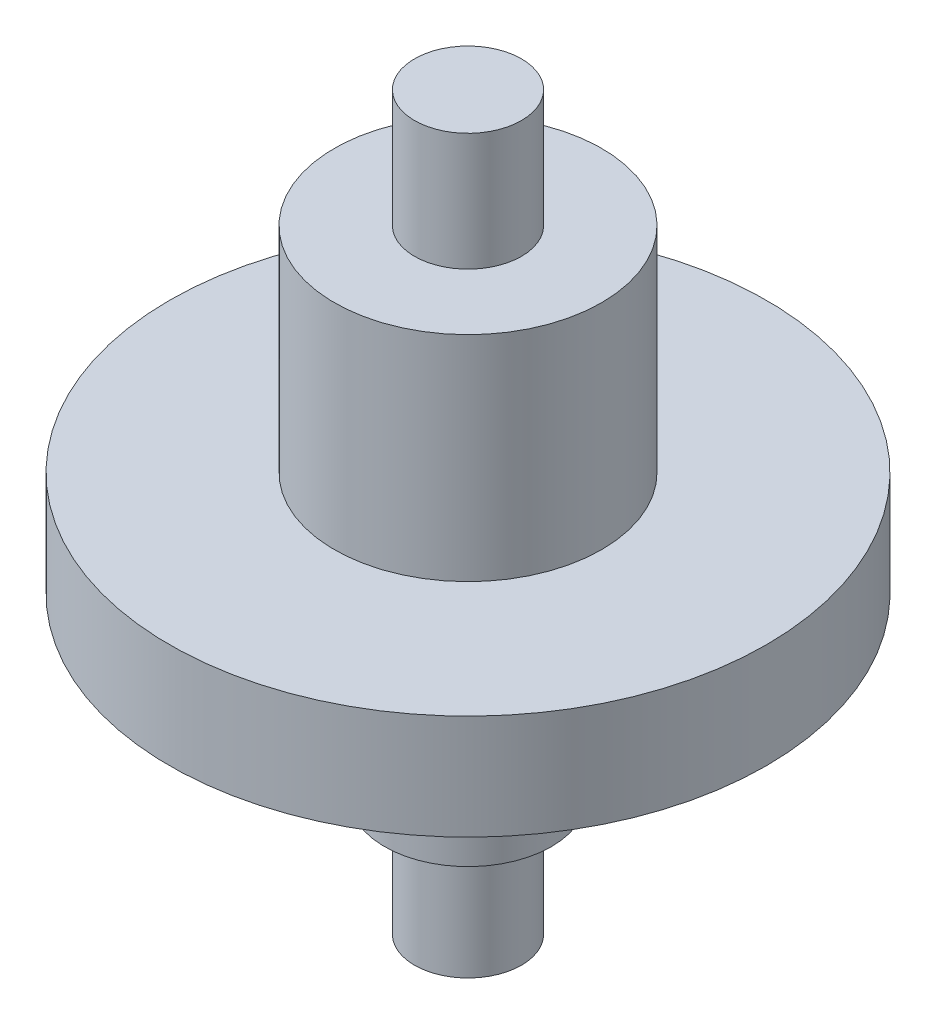
ISO-10303-21;
HEADER;
FILE_DESCRIPTION(('STEP AP214'),'2;1');
FILE_NAME('part.step','',(''),(''),'','','');
FILE_SCHEMA(('AUTOMOTIVE_DESIGN { 1 0 10303 214 1 1 1 1 }'));
ENDSEC;
DATA;
#1=APPLICATION_CONTEXT('core data for automotive mechanical design processes');
#2=APPLICATION_PROTOCOL_DEFINITION('international standard','automotive_design',2000,#1);
#3=PRODUCT_CONTEXT('',#1,'mechanical');
#4=PRODUCT('Part','Part','',(#3));
#5=PRODUCT_RELATED_PRODUCT_CATEGORY('part','',(#4));
#6=PRODUCT_DEFINITION_FORMATION('','',#4);
#7=PRODUCT_DEFINITION_CONTEXT('part definition',#1,'design');
#8=PRODUCT_DEFINITION('design','',#6,#7);
#9=PRODUCT_DEFINITION_SHAPE('','',#8);
#10=(LENGTH_UNIT() NAMED_UNIT(*) SI_UNIT(.MILLI.,.METRE.));
#11=(NAMED_UNIT(*) PLANE_ANGLE_UNIT() SI_UNIT($,.RADIAN.));
#12=(NAMED_UNIT(*) SI_UNIT($,.STERADIAN.) SOLID_ANGLE_UNIT());
#13=UNCERTAINTY_MEASURE_WITH_UNIT(LENGTH_MEASURE(1.E-05),#10,'distance_accuracy_value','');
#14=(GEOMETRIC_REPRESENTATION_CONTEXT(3) GLOBAL_UNCERTAINTY_ASSIGNED_CONTEXT((#13)) GLOBAL_UNIT_ASSIGNED_CONTEXT((#10,
#11,#12)) REPRESENTATION_CONTEXT('',''));
#15=CARTESIAN_POINT('',(0.,0.,0.));
#16=DIRECTION('',(0.,0.,1.));
#17=DIRECTION('',(1.,0.,0.));
#18=AXIS2_PLACEMENT_3D('',#15,#16,#17);
#19=CARTESIAN_POINT('',(1.25000000000002,0.,0.));
#20=DIRECTION('',(0.,-1.,0.));
#21=DIRECTION('',(1.,0.,0.));
#22=AXIS2_PLACEMENT_3D('',#19,#20,#21);
#23=PLANE('',#22);
#24=CARTESIAN_POINT('',(0.,0.,0.));
#25=DIRECTION('',(0.,-1.,0.));
#26=DIRECTION('',(1.,0.,0.));
#27=AXIS2_PLACEMENT_3D('',#24,#25,#26);
#28=CIRCLE('',#27,1.25000000000002);
#29=CARTESIAN_POINT('',(1.25000000000002,0.,0.));
#30=VERTEX_POINT('',#29);
#31=EDGE_CURVE('E66',#30,#30,#28,.T.);
#32=ORIENTED_EDGE('',*,*,#31,.T.);
#33=EDGE_LOOP('',(#32));
#34=FACE_BOUND('',#33,.T.);
#35=ADVANCED_FACE('F32',(#34),#23,.T.);
#36=CARTESIAN_POINT('',(0.,17.1,0.));
#37=DIRECTION('',(0.,1.,0.));
#38=DIRECTION('',(-1.,0.,0.));
#39=AXIS2_PLACEMENT_3D('',#36,#37,#38);
#40=PLANE('',#39);
#41=CARTESIAN_POINT('',(0.,17.1,0.));
#42=DIRECTION('',(0.,-1.,0.));
#43=DIRECTION('',(1.,0.,0.));
#44=AXIS2_PLACEMENT_3D('',#41,#42,#43);
#45=CIRCLE('',#44,1.25);
#46=CARTESIAN_POINT('',(1.25,17.1,0.));
#47=VERTEX_POINT('',#46);
#48=EDGE_CURVE('E10',#47,#47,#45,.T.);
#49=ORIENTED_EDGE('',*,*,#48,.F.);
#50=EDGE_LOOP('',(#49));
#51=FACE_BOUND('',#50,.T.);
#52=ADVANCED_FACE('F83',(#51),#40,.T.);
#53=CARTESIAN_POINT('',(0.,0.,0.));
#54=DIRECTION('',(0.,-1.,0.));
#55=DIRECTION('',(1.,0.,0.));
#56=AXIS2_PLACEMENT_3D('',#53,#54,#55);
#57=CYLINDRICAL_SURFACE('',#56,1.25);
#58=ORIENTED_EDGE('',*,*,#48,.T.);
#59=EDGE_LOOP('',(#58));
#60=FACE_BOUND('',#59,.T.);
#61=CARTESIAN_POINT('',(0.,14.35,0.));
#62=DIRECTION('',(0.,-1.,0.));
#63=DIRECTION('',(1.,0.,0.));
#64=AXIS2_PLACEMENT_3D('',#61,#62,#63);
#65=CIRCLE('',#64,1.25);
#66=CARTESIAN_POINT('',(1.25,14.35,0.));
#67=VERTEX_POINT('',#66);
#68=EDGE_CURVE('E38',#67,#67,#65,.T.);
#69=ORIENTED_EDGE('',*,*,#68,.F.);
#70=EDGE_LOOP('',(#69));
#71=FACE_BOUND('',#70,.T.);
#72=ADVANCED_FACE('F87',(#60,#71),#57,.T.);
#73=CARTESIAN_POINT('',(1.25,14.35,0.));
#74=DIRECTION('',(0.,1.,0.));
#75=DIRECTION('',(-1.,0.,0.));
#76=AXIS2_PLACEMENT_3D('',#73,#74,#75);
#77=PLANE('',#76);
#78=ORIENTED_EDGE('',*,*,#68,.T.);
#79=EDGE_LOOP('',(#78));
#80=FACE_BOUND('',#79,.T.);
#81=CARTESIAN_POINT('',(0.,14.35,0.));
#82=DIRECTION('',(0.,-1.,0.));
#83=DIRECTION('',(1.,0.,0.));
#84=AXIS2_PLACEMENT_3D('',#81,#82,#83);
#85=CIRCLE('',#84,3.125);
#86=CARTESIAN_POINT('',(3.125,14.35,0.));
#87=VERTEX_POINT('',#86);
#88=EDGE_CURVE('E42',#87,#87,#85,.T.);
#89=ORIENTED_EDGE('',*,*,#88,.F.);
#90=EDGE_LOOP('',(#89));
#91=FACE_BOUND('',#90,.T.);
#92=ADVANCED_FACE('F92',(#80,#91),#77,.T.);
#93=CARTESIAN_POINT('',(0.,0.,0.));
#94=DIRECTION('',(0.,-1.,0.));
#95=DIRECTION('',(1.,0.,0.));
#96=AXIS2_PLACEMENT_3D('',#93,#94,#95);
#97=CYLINDRICAL_SURFACE('',#96,3.125);
#98=ORIENTED_EDGE('',*,*,#88,.T.);
#99=EDGE_LOOP('',(#98));
#100=FACE_BOUND('',#99,.T.);
#101=CARTESIAN_POINT('',(0.,9.35,0.));
#102=DIRECTION('',(0.,-1.,0.));
#103=DIRECTION('',(1.,0.,0.));
#104=AXIS2_PLACEMENT_3D('',#101,#102,#103);
#105=CIRCLE('',#104,3.12500000000001);
#106=CARTESIAN_POINT('',(3.12500000000001,9.35,0.));
#107=VERTEX_POINT('',#106);
#108=EDGE_CURVE('E46',#107,#107,#105,.T.);
#109=ORIENTED_EDGE('',*,*,#108,.F.);
#110=EDGE_LOOP('',(#109));
#111=FACE_BOUND('',#110,.T.);
#112=ADVANCED_FACE('F97',(#100,#111),#97,.T.);
#113=CARTESIAN_POINT('',(3.12500000000001,9.35,0.));
#114=DIRECTION('',(0.,1.,0.));
#115=DIRECTION('',(-1.,0.,0.));
#116=AXIS2_PLACEMENT_3D('',#113,#114,#115);
#117=PLANE('',#116);
#118=ORIENTED_EDGE('',*,*,#108,.T.);
#119=EDGE_LOOP('',(#118));
#120=FACE_BOUND('',#119,.T.);
#121=CARTESIAN_POINT('',(0.,9.35,0.));
#122=DIRECTION('',(0.,-1.,0.));
#123=DIRECTION('',(1.,0.,0.));
#124=AXIS2_PLACEMENT_3D('',#121,#122,#123);
#125=CIRCLE('',#124,6.975);
#126=CARTESIAN_POINT('',(6.975,9.35,0.));
#127=VERTEX_POINT('',#126);
#128=EDGE_CURVE('E51',#127,#127,#125,.T.);
#129=ORIENTED_EDGE('',*,*,#128,.F.);
#130=EDGE_LOOP('',(#129));
#131=FACE_BOUND('',#130,.T.);
#132=ADVANCED_FACE('F100',(#120,#131),#117,.T.);
#133=CARTESIAN_POINT('',(0.,0.,0.));
#134=DIRECTION('',(0.,-1.,0.));
#135=DIRECTION('',(1.,0.,0.));
#136=AXIS2_PLACEMENT_3D('',#133,#134,#135);
#137=CYLINDRICAL_SURFACE('',#136,6.975);
#138=ORIENTED_EDGE('',*,*,#128,.T.);
#139=EDGE_LOOP('',(#138));
#140=FACE_BOUND('',#139,.T.);
#141=CARTESIAN_POINT('',(0.,6.9,0.));
#142=DIRECTION('',(0.,-1.,0.));
#143=DIRECTION('',(1.,0.,0.));
#144=AXIS2_PLACEMENT_3D('',#141,#142,#143);
#145=CIRCLE('',#144,6.975);
#146=CARTESIAN_POINT('',(6.975,6.9,0.));
#147=VERTEX_POINT('',#146);
#148=EDGE_CURVE('E54',#147,#147,#145,.T.);
#149=ORIENTED_EDGE('',*,*,#148,.F.);
#150=EDGE_LOOP('',(#149));
#151=FACE_BOUND('',#150,.T.);
#152=ADVANCED_FACE('F104',(#140,#151),#137,.T.);
#153=CARTESIAN_POINT('',(6.975,6.9,0.));
#154=DIRECTION('',(0.,-1.,0.));
#155=DIRECTION('',(1.,0.,0.));
#156=AXIS2_PLACEMENT_3D('',#153,#154,#155);
#157=PLANE('',#156);
#158=ORIENTED_EDGE('',*,*,#148,.T.);
#159=EDGE_LOOP('',(#158));
#160=FACE_BOUND('',#159,.T.);
#161=CARTESIAN_POINT('',(0.,6.9,0.));
#162=DIRECTION('',(0.,-1.,0.));
#163=DIRECTION('',(1.,0.,0.));
#164=AXIS2_PLACEMENT_3D('',#161,#162,#163);
#165=CIRCLE('',#164,1.95);
#166=CARTESIAN_POINT('',(1.95,6.9,0.));
#167=VERTEX_POINT('',#166);
#168=EDGE_CURVE('E57',#167,#167,#165,.T.);
#169=ORIENTED_EDGE('',*,*,#168,.F.);
#170=EDGE_LOOP('',(#169));
#171=FACE_BOUND('',#170,.T.);
#172=ADVANCED_FACE('F108',(#160,#171),#157,.T.);
#173=CARTESIAN_POINT('',(0.,0.,0.));
#174=DIRECTION('',(0.,-1.,0.));
#175=DIRECTION('',(1.,0.,0.));
#176=AXIS2_PLACEMENT_3D('',#173,#174,#175);
#177=CYLINDRICAL_SURFACE('',#176,1.95);
#178=ORIENTED_EDGE('',*,*,#168,.T.);
#179=EDGE_LOOP('',(#178));
#180=FACE_BOUND('',#179,.T.);
#181=CARTESIAN_POINT('',(0.,2.75,0.));
#182=DIRECTION('',(0.,-1.,0.));
#183=DIRECTION('',(1.,0.,0.));
#184=AXIS2_PLACEMENT_3D('',#181,#182,#183);
#185=CIRCLE('',#184,1.95);
#186=CARTESIAN_POINT('',(1.95,2.75,0.));
#187=VERTEX_POINT('',#186);
#188=EDGE_CURVE('E60',#187,#187,#185,.T.);
#189=ORIENTED_EDGE('',*,*,#188,.F.);
#190=EDGE_LOOP('',(#189));
#191=FACE_BOUND('',#190,.T.);
#192=ADVANCED_FACE('F79',(#180,#191),#177,.T.);
#193=CARTESIAN_POINT('',(1.95,2.75,0.));
#194=DIRECTION('',(0.,-1.,0.));
#195=DIRECTION('',(1.,0.,0.));
#196=AXIS2_PLACEMENT_3D('',#193,#194,#195);
#197=PLANE('',#196);
#198=ORIENTED_EDGE('',*,*,#188,.T.);
#199=EDGE_LOOP('',(#198));
#200=FACE_BOUND('',#199,.T.);
#201=CARTESIAN_POINT('',(0.,2.75,0.));
#202=DIRECTION('',(0.,-1.,0.));
#203=DIRECTION('',(1.,0.,0.));
#204=AXIS2_PLACEMENT_3D('',#201,#202,#203);
#205=CIRCLE('',#204,1.25000000000001);
#206=CARTESIAN_POINT('',(1.25000000000001,2.75,0.));
#207=VERTEX_POINT('',#206);
#208=EDGE_CURVE('E63',#207,#207,#205,.T.);
#209=ORIENTED_EDGE('',*,*,#208,.F.);
#210=EDGE_LOOP('',(#209));
#211=FACE_BOUND('',#210,.T.);
#212=ADVANCED_FACE('F73',(#200,#211),#197,.T.);
#213=CARTESIAN_POINT('',(0.,0.,0.));
#214=DIRECTION('',(0.,-1.,0.));
#215=DIRECTION('',(1.,0.,0.));
#216=AXIS2_PLACEMENT_3D('',#213,#214,#215);
#217=CYLINDRICAL_SURFACE('',#216,1.25000000000001);
#218=ORIENTED_EDGE('',*,*,#208,.T.);
#219=EDGE_LOOP('',(#218));
#220=FACE_BOUND('',#219,.T.);
#221=ORIENTED_EDGE('',*,*,#31,.F.);
#222=EDGE_LOOP('',(#221));
#223=FACE_BOUND('',#222,.T.);
#224=ADVANCED_FACE('F71',(#220,#223),#217,.T.);
#225=CLOSED_SHELL('',(#35,#52,#72,#92,#112,#132,#152,#172,#192,#212,#224));
#226=MANIFOLD_SOLID_BREP('B2',#225);
#227=ADVANCED_BREP_SHAPE_REPRESENTATION('',(#18,#226),#14);
#228=SHAPE_DEFINITION_REPRESENTATION(#9,#227);
ENDSEC;
END-ISO-10303-21;
